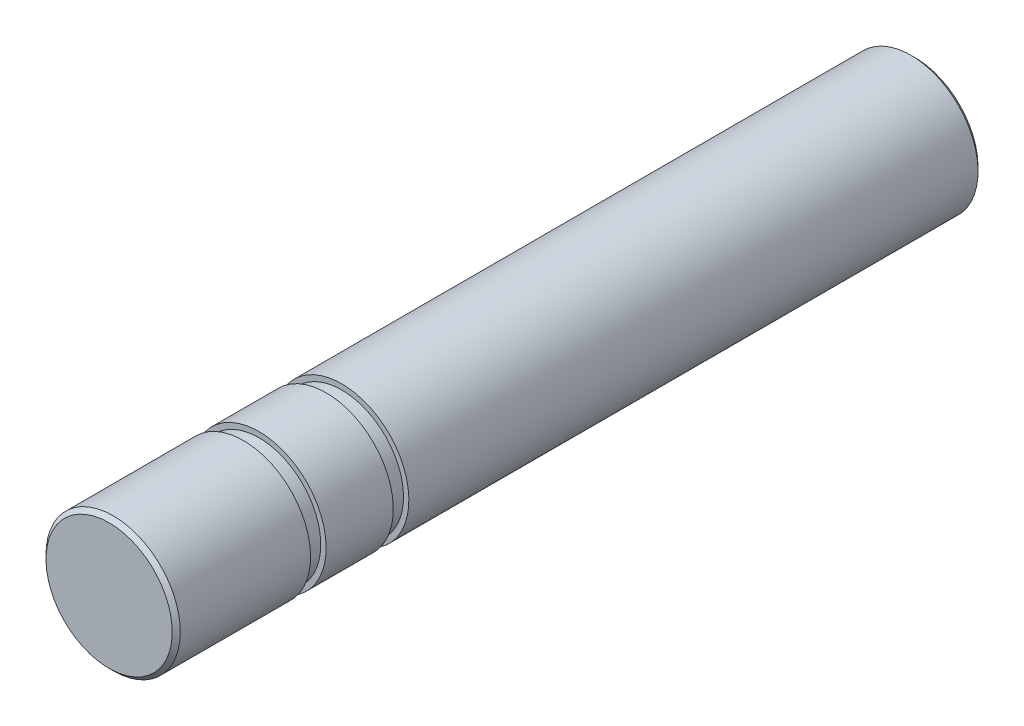
ISO-10303-21;
HEADER;
FILE_DESCRIPTION(('STEP AP214'),'2;1');
FILE_NAME('part.step','',(''),(''),'','','');
FILE_SCHEMA(('AUTOMOTIVE_DESIGN { 1 0 10303 214 1 1 1 1 }'));
ENDSEC;
DATA;
#1=APPLICATION_CONTEXT('core data for automotive mechanical design processes');
#2=APPLICATION_PROTOCOL_DEFINITION('international standard','automotive_design',2000,#1);
#3=PRODUCT_CONTEXT('',#1,'mechanical');
#4=PRODUCT('Part','Part','',(#3));
#5=PRODUCT_RELATED_PRODUCT_CATEGORY('part','',(#4));
#6=PRODUCT_DEFINITION_FORMATION('','',#4);
#7=PRODUCT_DEFINITION_CONTEXT('part definition',#1,'design');
#8=PRODUCT_DEFINITION('design','',#6,#7);
#9=PRODUCT_DEFINITION_SHAPE('','',#8);
#10=(LENGTH_UNIT() NAMED_UNIT(*) SI_UNIT(.MILLI.,.METRE.));
#11=(NAMED_UNIT(*) PLANE_ANGLE_UNIT() SI_UNIT($,.RADIAN.));
#12=(NAMED_UNIT(*) SI_UNIT($,.STERADIAN.) SOLID_ANGLE_UNIT());
#13=UNCERTAINTY_MEASURE_WITH_UNIT(LENGTH_MEASURE(1.E-05),#10,'distance_accuracy_value','');
#14=(GEOMETRIC_REPRESENTATION_CONTEXT(3) GLOBAL_UNCERTAINTY_ASSIGNED_CONTEXT((#13)) GLOBAL_UNIT_ASSIGNED_CONTEXT((#10,
#11,#12)) REPRESENTATION_CONTEXT('',''));
#15=CARTESIAN_POINT('',(0.,0.,0.));
#16=DIRECTION('',(0.,0.,1.));
#17=DIRECTION('',(1.,0.,0.));
#18=AXIS2_PLACEMENT_3D('',#15,#16,#17);
#19=CARTESIAN_POINT('',(0.,0.,19.05));
#20=DIRECTION('',(0.,0.,1.));
#21=DIRECTION('',(0.,-1.,0.));
#22=AXIS2_PLACEMENT_3D('',#19,#20,#21);
#23=CYLINDRICAL_SURFACE('',#22,3.175);
#24=CARTESIAN_POINT('',(0.,0.,18.8595));
#25=DIRECTION('',(0.,0.,-1.));
#26=DIRECTION('',(0.,1.,0.));
#27=AXIS2_PLACEMENT_3D('',#24,#25,#26);
#28=CIRCLE('',#27,3.175);
#29=CARTESIAN_POINT('',(0.,3.17499999999999,18.8595));
#30=VERTEX_POINT('',#29);
#31=EDGE_CURVE('E10',#30,#30,#28,.T.);
#32=ORIENTED_EDGE('',*,*,#31,.T.);
#33=EDGE_LOOP('',(#32));
#34=FACE_BOUND('',#33,.T.);
#35=CARTESIAN_POINT('',(0.,0.,12.7));
#36=DIRECTION('',(0.,0.,1.));
#37=DIRECTION('',(0.,-1.,0.));
#38=AXIS2_PLACEMENT_3D('',#35,#36,#37);
#39=CIRCLE('',#38,3.175);
#40=CARTESIAN_POINT('',(0.,-3.17500000000001,12.7));
#41=VERTEX_POINT('',#40);
#42=EDGE_CURVE('E54',#41,#41,#39,.T.);
#43=ORIENTED_EDGE('',*,*,#42,.T.);
#44=EDGE_LOOP('',(#43));
#45=FACE_BOUND('',#44,.T.);
#46=ADVANCED_FACE('F34',(#34,#45),#23,.T.);
#47=CARTESIAN_POINT('',(0.,3.175,12.7));
#48=DIRECTION('',(0.,0.,1.));
#49=DIRECTION('',(0.,-1.,0.));
#50=AXIS2_PLACEMENT_3D('',#47,#48,#49);
#51=PLANE('',#50);
#52=ORIENTED_EDGE('',*,*,#42,.F.);
#53=EDGE_LOOP('',(#52));
#54=FACE_BOUND('',#53,.T.);
#55=CARTESIAN_POINT('',(0.,0.,12.7));
#56=DIRECTION('',(0.,0.,1.));
#57=DIRECTION('',(0.,-1.,0.));
#58=AXIS2_PLACEMENT_3D('',#55,#56,#57);
#59=CIRCLE('',#58,2.921);
#60=CARTESIAN_POINT('',(0.,-2.921,12.7));
#61=VERTEX_POINT('',#60);
#62=EDGE_CURVE('E57',#61,#61,#59,.T.);
#63=ORIENTED_EDGE('',*,*,#62,.T.);
#64=EDGE_LOOP('',(#63));
#65=FACE_BOUND('',#64,.T.);
#66=ADVANCED_FACE('F97',(#54,#65),#51,.F.);
#67=CARTESIAN_POINT('',(0.,0.,19.05));
#68=DIRECTION('',(0.,0.,1.));
#69=DIRECTION('',(0.,-1.,0.));
#70=AXIS2_PLACEMENT_3D('',#67,#68,#69);
#71=CYLINDRICAL_SURFACE('',#70,2.921);
#72=ORIENTED_EDGE('',*,*,#62,.F.);
#73=EDGE_LOOP('',(#72));
#74=FACE_BOUND('',#73,.T.);
#75=CARTESIAN_POINT('',(0.,0.,11.9634));
#76=DIRECTION('',(0.,0.,1.));
#77=DIRECTION('',(0.,-1.,0.));
#78=AXIS2_PLACEMENT_3D('',#75,#76,#77);
#79=CIRCLE('',#78,2.921);
#80=CARTESIAN_POINT('',(0.,-2.921,11.9634));
#81=VERTEX_POINT('',#80);
#82=EDGE_CURVE('E60',#81,#81,#79,.T.);
#83=ORIENTED_EDGE('',*,*,#82,.T.);
#84=EDGE_LOOP('',(#83));
#85=FACE_BOUND('',#84,.T.);
#86=ADVANCED_FACE('F102',(#74,#85),#71,.T.);
#87=CARTESIAN_POINT('',(0.,2.92099999999999,11.9634));
#88=DIRECTION('',(0.,0.,-1.));
#89=DIRECTION('',(0.,1.,0.));
#90=AXIS2_PLACEMENT_3D('',#87,#88,#89);
#91=PLANE('',#90);
#92=ORIENTED_EDGE('',*,*,#82,.F.);
#93=EDGE_LOOP('',(#92));
#94=FACE_BOUND('',#93,.T.);
#95=CARTESIAN_POINT('',(0.,0.,11.9634));
#96=DIRECTION('',(0.,0.,1.));
#97=DIRECTION('',(0.,-1.,0.));
#98=AXIS2_PLACEMENT_3D('',#95,#96,#97);
#99=CIRCLE('',#98,3.175);
#100=CARTESIAN_POINT('',(0.,-3.17500000000001,11.9634));
#101=VERTEX_POINT('',#100);
#102=EDGE_CURVE('E63',#101,#101,#99,.T.);
#103=ORIENTED_EDGE('',*,*,#102,.T.);
#104=EDGE_LOOP('',(#103));
#105=FACE_BOUND('',#104,.T.);
#106=ADVANCED_FACE('F169',(#94,#105),#91,.F.);
#107=CARTESIAN_POINT('',(0.,0.,19.05));
#108=DIRECTION('',(0.,0.,1.));
#109=DIRECTION('',(0.,-1.,0.));
#110=AXIS2_PLACEMENT_3D('',#107,#108,#109);
#111=CYLINDRICAL_SURFACE('',#110,3.175);
#112=ORIENTED_EDGE('',*,*,#102,.F.);
#113=EDGE_LOOP('',(#112));
#114=FACE_BOUND('',#113,.T.);
#115=CARTESIAN_POINT('',(0.,0.,8.7884));
#116=DIRECTION('',(0.,0.,1.));
#117=DIRECTION('',(0.,-1.,0.));
#118=AXIS2_PLACEMENT_3D('',#115,#116,#117);
#119=CIRCLE('',#118,3.175);
#120=CARTESIAN_POINT('',(0.,-3.175,8.7884));
#121=VERTEX_POINT('',#120);
#122=EDGE_CURVE('E66',#121,#121,#119,.T.);
#123=ORIENTED_EDGE('',*,*,#122,.T.);
#124=EDGE_LOOP('',(#123));
#125=FACE_BOUND('',#124,.T.);
#126=ADVANCED_FACE('F159',(#114,#125),#111,.T.);
#127=CARTESIAN_POINT('',(0.,3.175,8.7884));
#128=DIRECTION('',(0.,0.,1.));
#129=DIRECTION('',(0.,-1.,0.));
#130=AXIS2_PLACEMENT_3D('',#127,#128,#129);
#131=PLANE('',#130);
#132=ORIENTED_EDGE('',*,*,#122,.F.);
#133=EDGE_LOOP('',(#132));
#134=FACE_BOUND('',#133,.T.);
#135=CARTESIAN_POINT('',(0.,0.,8.7884));
#136=DIRECTION('',(0.,0.,1.));
#137=DIRECTION('',(0.,-1.,0.));
#138=AXIS2_PLACEMENT_3D('',#135,#136,#137);
#139=CIRCLE('',#138,2.921);
#140=CARTESIAN_POINT('',(0.,-2.921,8.7884));
#141=VERTEX_POINT('',#140);
#142=EDGE_CURVE('E69',#141,#141,#139,.T.);
#143=ORIENTED_EDGE('',*,*,#142,.T.);
#144=EDGE_LOOP('',(#143));
#145=FACE_BOUND('',#144,.T.);
#146=ADVANCED_FACE('F149',(#134,#145),#131,.F.);
#147=CARTESIAN_POINT('',(0.,0.,19.05));
#148=DIRECTION('',(0.,0.,1.));
#149=DIRECTION('',(0.,-1.,0.));
#150=AXIS2_PLACEMENT_3D('',#147,#148,#149);
#151=CYLINDRICAL_SURFACE('',#150,2.921);
#152=ORIENTED_EDGE('',*,*,#142,.F.);
#153=EDGE_LOOP('',(#152));
#154=FACE_BOUND('',#153,.T.);
#155=CARTESIAN_POINT('',(0.,0.,8.0518));
#156=DIRECTION('',(0.,0.,1.));
#157=DIRECTION('',(0.,-1.,0.));
#158=AXIS2_PLACEMENT_3D('',#155,#156,#157);
#159=CIRCLE('',#158,2.921);
#160=CARTESIAN_POINT('',(0.,-2.921,8.0518));
#161=VERTEX_POINT('',#160);
#162=EDGE_CURVE('E72',#161,#161,#159,.T.);
#163=ORIENTED_EDGE('',*,*,#162,.T.);
#164=EDGE_LOOP('',(#163));
#165=FACE_BOUND('',#164,.T.);
#166=ADVANCED_FACE('F93',(#154,#165),#151,.T.);
#167=CARTESIAN_POINT('',(0.,2.92099999999999,8.05180000000001));
#168=DIRECTION('',(0.,0.,-1.));
#169=DIRECTION('',(0.,1.,0.));
#170=AXIS2_PLACEMENT_3D('',#167,#168,#169);
#171=PLANE('',#170);
#172=ORIENTED_EDGE('',*,*,#162,.F.);
#173=EDGE_LOOP('',(#172));
#174=FACE_BOUND('',#173,.T.);
#175=CARTESIAN_POINT('',(0.,0.,8.0518));
#176=DIRECTION('',(0.,0.,1.));
#177=DIRECTION('',(0.,-1.,0.));
#178=AXIS2_PLACEMENT_3D('',#175,#176,#177);
#179=CIRCLE('',#178,3.175);
#180=CARTESIAN_POINT('',(0.,-3.175,8.0518));
#181=VERTEX_POINT('',#180);
#182=EDGE_CURVE('E75',#181,#181,#179,.T.);
#183=ORIENTED_EDGE('',*,*,#182,.T.);
#184=EDGE_LOOP('',(#183));
#185=FACE_BOUND('',#184,.T.);
#186=ADVANCED_FACE('F79',(#174,#185),#171,.F.);
#187=CARTESIAN_POINT('',(0.,0.,19.05));
#188=DIRECTION('',(0.,0.,1.));
#189=DIRECTION('',(0.,-1.,0.));
#190=AXIS2_PLACEMENT_3D('',#187,#188,#189);
#191=CYLINDRICAL_SURFACE('',#190,3.175);
#192=CARTESIAN_POINT('',(0.,0.,-18.8595));
#193=DIRECTION('',(0.,0.,1.));
#194=DIRECTION('',(0.,-1.,0.));
#195=AXIS2_PLACEMENT_3D('',#192,#193,#194);
#196=CIRCLE('',#195,3.175);
#197=CARTESIAN_POINT('',(0.,-3.17499999999999,-18.8595));
#198=VERTEX_POINT('',#197);
#199=EDGE_CURVE('E49',#198,#198,#196,.T.);
#200=ORIENTED_EDGE('',*,*,#199,.T.);
#201=EDGE_LOOP('',(#200));
#202=FACE_BOUND('',#201,.T.);
#203=ORIENTED_EDGE('',*,*,#182,.F.);
#204=EDGE_LOOP('',(#203));
#205=FACE_BOUND('',#204,.T.);
#206=ADVANCED_FACE('F81',(#202,#205),#191,.T.);
#207=CARTESIAN_POINT('',(0.,0.,-19.05));
#208=DIRECTION('',(0.,0.,1.));
#209=DIRECTION('',(0.,-1.,0.));
#210=AXIS2_PLACEMENT_3D('',#207,#208,#209);
#211=PLANE('',#210);
#212=CARTESIAN_POINT('',(0.,0.,-19.05));
#213=DIRECTION('',(0.,0.,1.));
#214=DIRECTION('',(0.,-1.,0.));
#215=AXIS2_PLACEMENT_3D('',#212,#213,#214);
#216=CIRCLE('',#215,2.98449999999999);
#217=CARTESIAN_POINT('',(0.,-2.98449999999999,-19.05));
#218=VERTEX_POINT('',#217);
#219=EDGE_CURVE('E45',#218,#218,#216,.F.);
#220=ORIENTED_EDGE('',*,*,#219,.T.);
#221=EDGE_LOOP('',(#220));
#222=FACE_BOUND('',#221,.T.);
#223=ADVANCED_FACE('F83',(#222),#211,.F.);
#224=CARTESIAN_POINT('',(0.,3.175,19.05));
#225=DIRECTION('',(0.,0.,-1.));
#226=DIRECTION('',(0.,1.,0.));
#227=AXIS2_PLACEMENT_3D('',#224,#225,#226);
#228=PLANE('',#227);
#229=CARTESIAN_POINT('',(0.,0.,19.05));
#230=DIRECTION('',(0.,0.,-1.));
#231=DIRECTION('',(0.,1.,0.));
#232=AXIS2_PLACEMENT_3D('',#229,#230,#231);
#233=CIRCLE('',#232,2.98450000000001);
#234=CARTESIAN_POINT('',(0.,2.9845,19.05));
#235=VERTEX_POINT('',#234);
#236=EDGE_CURVE('E41',#235,#235,#233,.F.);
#237=ORIENTED_EDGE('',*,*,#236,.T.);
#238=EDGE_LOOP('',(#237));
#239=FACE_BOUND('',#238,.T.);
#240=ADVANCED_FACE('F90',(#239),#228,.F.);
#241=CARTESIAN_POINT('',(0.,0.,-18.8595));
#242=DIRECTION('',(0.,0.,1.));
#243=DIRECTION('',(0.,-1.,0.));
#244=AXIS2_PLACEMENT_3D('',#241,#242,#243);
#245=CONICAL_SURFACE('',#244,3.175,0.785398163397437);
#246=ORIENTED_EDGE('',*,*,#219,.F.);
#247=EDGE_LOOP('',(#246));
#248=FACE_BOUND('',#247,.T.);
#249=ORIENTED_EDGE('',*,*,#199,.F.);
#250=EDGE_LOOP('',(#249));
#251=FACE_BOUND('',#250,.T.);
#252=ADVANCED_FACE('F107',(#248,#251),#245,.T.);
#253=CARTESIAN_POINT('',(0.,0.,19.05));
#254=DIRECTION('',(0.,0.,-1.));
#255=DIRECTION('',(0.,1.,0.));
#256=AXIS2_PLACEMENT_3D('',#253,#254,#255);
#257=CONICAL_SURFACE('',#256,2.98450000000001,0.785398163397454);
#258=ORIENTED_EDGE('',*,*,#31,.F.);
#259=EDGE_LOOP('',(#258));
#260=FACE_BOUND('',#259,.T.);
#261=ORIENTED_EDGE('',*,*,#236,.F.);
#262=EDGE_LOOP('',(#261));
#263=FACE_BOUND('',#262,.T.);
#264=ADVANCED_FACE('F36',(#260,#263),#257,.T.);
#265=CLOSED_SHELL('',(#46,#66,#86,#106,#126,#146,#166,#186,#206,#223,#240,#252,#264));
#266=MANIFOLD_SOLID_BREP('B2',#265);
#267=ADVANCED_BREP_SHAPE_REPRESENTATION('',(#18,#266),#14);
#268=SHAPE_DEFINITION_REPRESENTATION(#9,#267);
ENDSEC;
END-ISO-10303-21;
